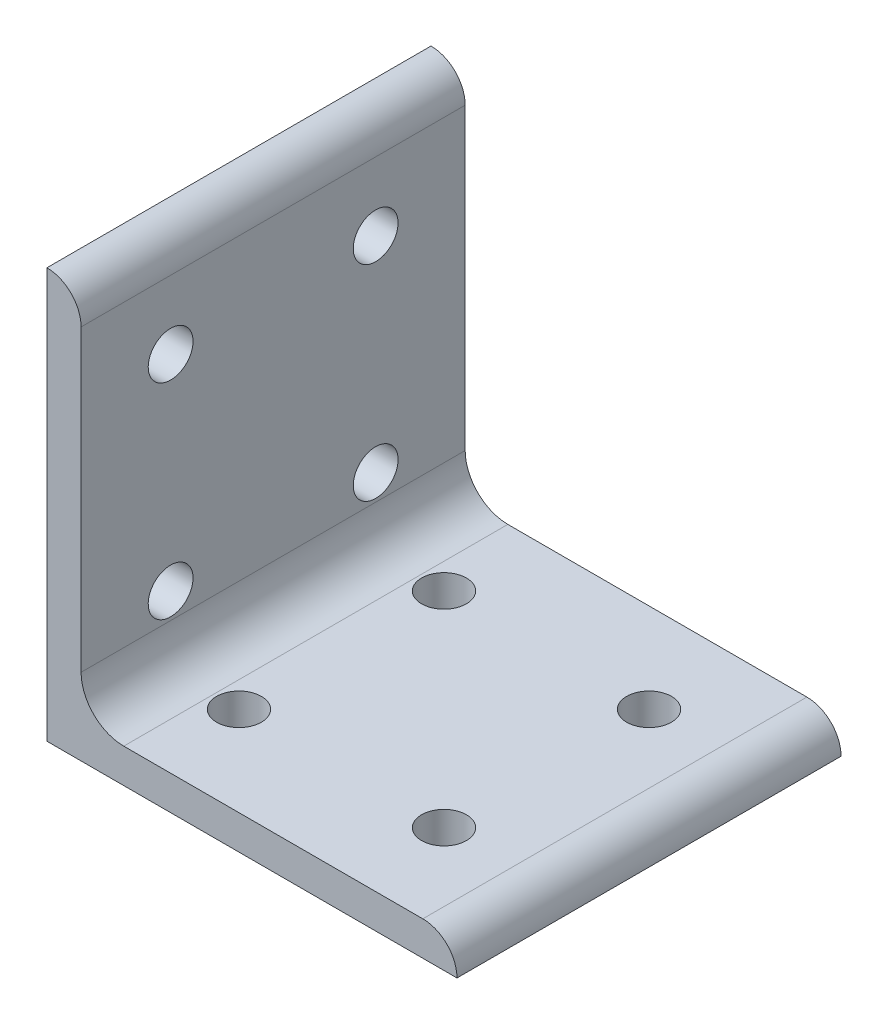
ISO-10303-21;
HEADER;
FILE_DESCRIPTION(('STEP AP214'),'2;1');
FILE_NAME('part.step','',(''),(''),'','','');
FILE_SCHEMA(('AUTOMOTIVE_DESIGN { 1 0 10303 214 1 1 1 1 }'));
ENDSEC;
DATA;
#1=APPLICATION_CONTEXT('core data for automotive mechanical design processes');
#2=APPLICATION_PROTOCOL_DEFINITION('international standard','automotive_design',2000,#1);
#3=PRODUCT_CONTEXT('',#1,'mechanical');
#4=PRODUCT('Part','Part','',(#3));
#5=PRODUCT_RELATED_PRODUCT_CATEGORY('part','',(#4));
#6=PRODUCT_DEFINITION_FORMATION('','',#4);
#7=PRODUCT_DEFINITION_CONTEXT('part definition',#1,'design');
#8=PRODUCT_DEFINITION('design','',#6,#7);
#9=PRODUCT_DEFINITION_SHAPE('','',#8);
#10=(LENGTH_UNIT() NAMED_UNIT(*) SI_UNIT(.MILLI.,.METRE.));
#11=(NAMED_UNIT(*) PLANE_ANGLE_UNIT() SI_UNIT($,.RADIAN.));
#12=(NAMED_UNIT(*) SI_UNIT($,.STERADIAN.) SOLID_ANGLE_UNIT());
#13=UNCERTAINTY_MEASURE_WITH_UNIT(LENGTH_MEASURE(1.E-05),#10,'distance_accuracy_value','');
#14=(GEOMETRIC_REPRESENTATION_CONTEXT(3) GLOBAL_UNCERTAINTY_ASSIGNED_CONTEXT((#13)) GLOBAL_UNIT_ASSIGNED_CONTEXT((#10,
#11,#12)) REPRESENTATION_CONTEXT('',''));
#15=CARTESIAN_POINT('',(0.,0.,0.));
#16=DIRECTION('',(0.,0.,1.));
#17=DIRECTION('',(1.,0.,0.));
#18=AXIS2_PLACEMENT_3D('',#15,#16,#17);
#19=CARTESIAN_POINT('',(6.35,69.85,35.687));
#20=DIRECTION('',(-1.,0.,0.));
#21=DIRECTION('',(0.,-1.,0.));
#22=AXIS2_PLACEMENT_3D('',#19,#20,#21);
#23=PLANE('',#22);
#24=DIRECTION('',(0.,1.,0.));
#25=VECTOR('',#24,1.);
#26=CARTESIAN_POINT('',(6.35,69.85,-35.687));
#27=LINE('',#26,#25);
#28=CARTESIAN_POINT('',(6.35,14.2748,-35.687));
#29=VERTEX_POINT('',#28);
#30=CARTESIAN_POINT('',(6.35,69.85,-35.687));
#31=VERTEX_POINT('',#30);
#32=EDGE_CURVE('E117',#29,#31,#27,.T.);
#33=ORIENTED_EDGE('',*,*,#32,.T.);
#34=DIRECTION('',(0.,0.,-1.));
#35=VECTOR('',#34,1.);
#36=CARTESIAN_POINT('',(6.35,69.85,35.687));
#37=LINE('',#36,#35);
#38=CARTESIAN_POINT('',(6.35,69.85,35.687));
#39=VERTEX_POINT('',#38);
#40=EDGE_CURVE('E114',#39,#31,#37,.T.);
#41=ORIENTED_EDGE('',*,*,#40,.F.);
#42=DIRECTION('',(0.,1.,0.));
#43=VECTOR('',#42,1.);
#44=CARTESIAN_POINT('',(6.35,69.85,35.687));
#45=LINE('',#44,#43);
#46=CARTESIAN_POINT('',(6.35,14.2748,35.687));
#47=VERTEX_POINT('',#46);
#48=EDGE_CURVE('E103',#47,#39,#45,.T.);
#49=ORIENTED_EDGE('',*,*,#48,.F.);
#50=DIRECTION('',(0.,0.,-1.));
#51=VECTOR('',#50,1.);
#52=CARTESIAN_POINT('',(6.35,14.2748,35.687));
#53=LINE('',#52,#51);
#54=EDGE_CURVE('E118',#47,#29,#53,.T.);
#55=ORIENTED_EDGE('',*,*,#54,.T.);
#56=EDGE_LOOP('',(#33,#41,#49,#55));
#57=FACE_BOUND('',#56,.T.);
#58=CARTESIAN_POINT('',(6.34999999999999,19.05,19.05));
#59=DIRECTION('',(-1.,0.,0.));
#60=DIRECTION('',(0.,-1.,0.));
#61=AXIS2_PLACEMENT_3D('',#58,#59,#60);
#62=CIRCLE('',#61,4.1656);
#63=CARTESIAN_POINT('',(6.35,14.8844,19.05));
#64=VERTEX_POINT('',#63);
#65=EDGE_CURVE('E225',#64,#64,#62,.F.);
#66=ORIENTED_EDGE('',*,*,#65,.F.);
#67=EDGE_LOOP('',(#66));
#68=FACE_BOUND('',#67,.T.);
#69=CARTESIAN_POINT('',(6.34999999999999,57.15,19.05));
#70=DIRECTION('',(-1.,0.,0.));
#71=DIRECTION('',(0.,-1.,0.));
#72=AXIS2_PLACEMENT_3D('',#69,#70,#71);
#73=CIRCLE('',#72,4.1656);
#74=CARTESIAN_POINT('',(6.35,52.9844,19.05));
#75=VERTEX_POINT('',#74);
#76=EDGE_CURVE('E222',#75,#75,#73,.F.);
#77=ORIENTED_EDGE('',*,*,#76,.F.);
#78=EDGE_LOOP('',(#77));
#79=FACE_BOUND('',#78,.T.);
#80=CARTESIAN_POINT('',(6.34999999999999,19.05,-19.05));
#81=DIRECTION('',(-1.,0.,0.));
#82=DIRECTION('',(0.,-1.,0.));
#83=AXIS2_PLACEMENT_3D('',#80,#81,#82);
#84=CIRCLE('',#83,4.1656);
#85=CARTESIAN_POINT('',(6.35,14.8844,-19.05));
#86=VERTEX_POINT('',#85);
#87=EDGE_CURVE('E218',#86,#86,#84,.F.);
#88=ORIENTED_EDGE('',*,*,#87,.F.);
#89=EDGE_LOOP('',(#88));
#90=FACE_BOUND('',#89,.T.);
#91=CARTESIAN_POINT('',(6.34999999999999,57.15,-19.05));
#92=DIRECTION('',(-1.,0.,0.));
#93=DIRECTION('',(0.,-1.,0.));
#94=AXIS2_PLACEMENT_3D('',#91,#92,#93);
#95=CIRCLE('',#94,4.1656);
#96=CARTESIAN_POINT('',(6.35,52.9844,-19.05));
#97=VERTEX_POINT('',#96);
#98=EDGE_CURVE('E212',#97,#97,#95,.F.);
#99=ORIENTED_EDGE('',*,*,#98,.F.);
#100=EDGE_LOOP('',(#99));
#101=FACE_BOUND('',#100,.T.);
#102=ADVANCED_FACE('F34',(#57,#68,#79,#90,#101),#23,.F.);
#103=CARTESIAN_POINT('',(0.,0.,35.687));
#104=DIRECTION('',(1.,0.,0.));
#105=DIRECTION('',(0.,0.,-1.));
#106=AXIS2_PLACEMENT_3D('',#103,#104,#105);
#107=PLANE('',#106);
#108=DIRECTION('',(0.,-1.,0.));
#109=VECTOR('',#108,1.);
#110=CARTESIAN_POINT('',(0.,0.,-35.687));
#111=LINE('',#110,#109);
#112=CARTESIAN_POINT('',(0.,76.2,-35.687));
#113=VERTEX_POINT('',#112);
#114=CARTESIAN_POINT('',(0.,0.,-35.687));
#115=VERTEX_POINT('',#114);
#116=EDGE_CURVE('E85',#113,#115,#111,.T.);
#117=ORIENTED_EDGE('',*,*,#116,.T.);
#118=DIRECTION('',(0.,0.,-1.));
#119=VECTOR('',#118,1.);
#120=CARTESIAN_POINT('',(0.,0.,35.687));
#121=LINE('',#120,#119);
#122=CARTESIAN_POINT('',(0.,0.,35.687));
#123=VERTEX_POINT('',#122);
#124=EDGE_CURVE('E123',#123,#115,#121,.T.);
#125=ORIENTED_EDGE('',*,*,#124,.F.);
#126=DIRECTION('',(0.,-1.,0.));
#127=VECTOR('',#126,1.);
#128=CARTESIAN_POINT('',(0.,0.,35.687));
#129=LINE('',#128,#127);
#130=CARTESIAN_POINT('',(0.,76.2,35.687));
#131=VERTEX_POINT('',#130);
#132=EDGE_CURVE('E53',#131,#123,#129,.T.);
#133=ORIENTED_EDGE('',*,*,#132,.F.);
#134=DIRECTION('',(0.,0.,-1.));
#135=VECTOR('',#134,1.);
#136=CARTESIAN_POINT('',(0.,76.2,35.687));
#137=LINE('',#136,#135);
#138=EDGE_CURVE('E119',#131,#113,#137,.T.);
#139=ORIENTED_EDGE('',*,*,#138,.T.);
#140=EDGE_LOOP('',(#117,#125,#133,#139));
#141=FACE_BOUND('',#140,.T.);
#142=CARTESIAN_POINT('',(0.,19.05,19.05));
#143=DIRECTION('',(1.,0.,0.));
#144=DIRECTION('',(0.,0.,-1.));
#145=AXIS2_PLACEMENT_3D('',#142,#143,#144);
#146=CIRCLE('',#145,4.1656);
#147=CARTESIAN_POINT('',(0.,19.05,14.8844));
#148=VERTEX_POINT('',#147);
#149=EDGE_CURVE('E199',#148,#148,#146,.T.);
#150=ORIENTED_EDGE('',*,*,#149,.T.);
#151=EDGE_LOOP('',(#150));
#152=FACE_BOUND('',#151,.T.);
#153=CARTESIAN_POINT('',(0.,57.15,19.05));
#154=DIRECTION('',(1.,0.,0.));
#155=DIRECTION('',(0.,0.,-1.));
#156=AXIS2_PLACEMENT_3D('',#153,#154,#155);
#157=CIRCLE('',#156,4.1656);
#158=CARTESIAN_POINT('',(0.,57.15,14.8844));
#159=VERTEX_POINT('',#158);
#160=EDGE_CURVE('E203',#159,#159,#157,.T.);
#161=ORIENTED_EDGE('',*,*,#160,.T.);
#162=EDGE_LOOP('',(#161));
#163=FACE_BOUND('',#162,.T.);
#164=CARTESIAN_POINT('',(0.,19.05,-19.05));
#165=DIRECTION('',(1.,0.,0.));
#166=DIRECTION('',(0.,0.,-1.));
#167=AXIS2_PLACEMENT_3D('',#164,#165,#166);
#168=CIRCLE('',#167,4.1656);
#169=CARTESIAN_POINT('',(0.,19.05,-23.2156));
#170=VERTEX_POINT('',#169);
#171=EDGE_CURVE('E207',#170,#170,#168,.T.);
#172=ORIENTED_EDGE('',*,*,#171,.T.);
#173=EDGE_LOOP('',(#172));
#174=FACE_BOUND('',#173,.T.);
#175=CARTESIAN_POINT('',(0.,57.15,-19.05));
#176=DIRECTION('',(1.,0.,0.));
#177=DIRECTION('',(0.,0.,-1.));
#178=AXIS2_PLACEMENT_3D('',#175,#176,#177);
#179=CIRCLE('',#178,4.1656);
#180=CARTESIAN_POINT('',(0.,57.15,-23.2156));
#181=VERTEX_POINT('',#180);
#182=EDGE_CURVE('E210',#181,#181,#179,.T.);
#183=ORIENTED_EDGE('',*,*,#182,.T.);
#184=EDGE_LOOP('',(#183));
#185=FACE_BOUND('',#184,.T.);
#186=ADVANCED_FACE('F192',(#141,#152,#163,#174,#185),#107,.F.);
#187=CARTESIAN_POINT('',(76.2,0.,35.687));
#188=DIRECTION('',(0.,1.,0.));
#189=DIRECTION('',(-1.,0.,0.));
#190=AXIS2_PLACEMENT_3D('',#187,#188,#189);
#191=PLANE('',#190);
#192=DIRECTION('',(1.,0.,0.));
#193=VECTOR('',#192,1.);
#194=CARTESIAN_POINT('',(76.2,0.,-35.687));
#195=LINE('',#194,#193);
#196=CARTESIAN_POINT('',(76.2,0.,-35.687));
#197=VERTEX_POINT('',#196);
#198=EDGE_CURVE('E127',#115,#197,#195,.T.);
#199=ORIENTED_EDGE('',*,*,#198,.T.);
#200=DIRECTION('',(0.,0.,-1.));
#201=VECTOR('',#200,1.);
#202=CARTESIAN_POINT('',(76.2,0.,35.687));
#203=LINE('',#202,#201);
#204=CARTESIAN_POINT('',(76.2,0.,35.687));
#205=VERTEX_POINT('',#204);
#206=EDGE_CURVE('E11',#205,#197,#203,.T.);
#207=ORIENTED_EDGE('',*,*,#206,.F.);
#208=DIRECTION('',(1.,0.,0.));
#209=VECTOR('',#208,1.);
#210=CARTESIAN_POINT('',(76.2,0.,35.687));
#211=LINE('',#210,#209);
#212=EDGE_CURVE('E140',#123,#205,#211,.T.);
#213=ORIENTED_EDGE('',*,*,#212,.F.);
#214=ORIENTED_EDGE('',*,*,#124,.T.);
#215=EDGE_LOOP('',(#199,#207,#213,#214));
#216=FACE_BOUND('',#215,.T.);
#217=CARTESIAN_POINT('',(19.05,0.,19.05));
#218=DIRECTION('',(0.,1.,0.));
#219=DIRECTION('',(0.,0.,1.));
#220=AXIS2_PLACEMENT_3D('',#217,#218,#219);
#221=CIRCLE('',#220,4.1656);
#222=CARTESIAN_POINT('',(19.05,0.,14.8844));
#223=VERTEX_POINT('',#222);
#224=EDGE_CURVE('E151',#223,#223,#221,.T.);
#225=ORIENTED_EDGE('',*,*,#224,.T.);
#226=EDGE_LOOP('',(#225));
#227=FACE_BOUND('',#226,.T.);
#228=CARTESIAN_POINT('',(57.15,0.,19.05));
#229=DIRECTION('',(0.,1.,0.));
#230=DIRECTION('',(0.,0.,1.));
#231=AXIS2_PLACEMENT_3D('',#228,#229,#230);
#232=CIRCLE('',#231,4.1656);
#233=CARTESIAN_POINT('',(57.15,0.,14.8844));
#234=VERTEX_POINT('',#233);
#235=EDGE_CURVE('E154',#234,#234,#232,.T.);
#236=ORIENTED_EDGE('',*,*,#235,.T.);
#237=EDGE_LOOP('',(#236));
#238=FACE_BOUND('',#237,.T.);
#239=CARTESIAN_POINT('',(19.05,0.,-19.05));
#240=DIRECTION('',(0.,1.,0.));
#241=DIRECTION('',(0.,0.,1.));
#242=AXIS2_PLACEMENT_3D('',#239,#240,#241);
#243=CIRCLE('',#242,4.1656);
#244=CARTESIAN_POINT('',(19.05,0.,-23.2156));
#245=VERTEX_POINT('',#244);
#246=EDGE_CURVE('E157',#245,#245,#243,.T.);
#247=ORIENTED_EDGE('',*,*,#246,.T.);
#248=EDGE_LOOP('',(#247));
#249=FACE_BOUND('',#248,.T.);
#250=CARTESIAN_POINT('',(57.15,0.,-19.05));
#251=DIRECTION('',(0.,1.,0.));
#252=DIRECTION('',(0.,0.,1.));
#253=AXIS2_PLACEMENT_3D('',#250,#251,#252);
#254=CIRCLE('',#253,4.1656);
#255=CARTESIAN_POINT('',(57.15,0.,-23.2156));
#256=VERTEX_POINT('',#255);
#257=EDGE_CURVE('E167',#256,#256,#254,.T.);
#258=ORIENTED_EDGE('',*,*,#257,.T.);
#259=EDGE_LOOP('',(#258));
#260=FACE_BOUND('',#259,.T.);
#261=ADVANCED_FACE('F36',(#216,#227,#238,#249,#260),#191,.F.);
#262=CARTESIAN_POINT('',(14.2748,6.35,35.687));
#263=DIRECTION('',(0.,-1.,0.));
#264=DIRECTION('',(1.,0.,0.));
#265=AXIS2_PLACEMENT_3D('',#262,#263,#264);
#266=PLANE('',#265);
#267=DIRECTION('',(-1.,0.,0.));
#268=VECTOR('',#267,1.);
#269=CARTESIAN_POINT('',(14.2748,6.35,-35.687));
#270=LINE('',#269,#268);
#271=CARTESIAN_POINT('',(69.85,6.35,-35.687));
#272=VERTEX_POINT('',#271);
#273=CARTESIAN_POINT('',(14.2748,6.35,-35.687));
#274=VERTEX_POINT('',#273);
#275=EDGE_CURVE('E133',#272,#274,#270,.T.);
#276=ORIENTED_EDGE('',*,*,#275,.T.);
#277=DIRECTION('',(0.,0.,-1.));
#278=VECTOR('',#277,1.);
#279=CARTESIAN_POINT('',(14.2748,6.35,35.687));
#280=LINE('',#279,#278);
#281=CARTESIAN_POINT('',(14.2748,6.35,35.687));
#282=VERTEX_POINT('',#281);
#283=EDGE_CURVE('E144',#282,#274,#280,.T.);
#284=ORIENTED_EDGE('',*,*,#283,.F.);
#285=DIRECTION('',(-1.,0.,0.));
#286=VECTOR('',#285,1.);
#287=CARTESIAN_POINT('',(14.2748,6.35,35.687));
#288=LINE('',#287,#286);
#289=CARTESIAN_POINT('',(69.85,6.35,35.687));
#290=VERTEX_POINT('',#289);
#291=EDGE_CURVE('E175',#290,#282,#288,.T.);
#292=ORIENTED_EDGE('',*,*,#291,.F.);
#293=DIRECTION('',(0.,0.,-1.));
#294=VECTOR('',#293,1.);
#295=CARTESIAN_POINT('',(69.85,6.35,35.687));
#296=LINE('',#295,#294);
#297=EDGE_CURVE('E44',#290,#272,#296,.T.);
#298=ORIENTED_EDGE('',*,*,#297,.T.);
#299=EDGE_LOOP('',(#276,#284,#292,#298));
#300=FACE_BOUND('',#299,.T.);
#301=CARTESIAN_POINT('',(19.05,6.35000000000001,19.05));
#302=DIRECTION('',(0.,-1.,0.));
#303=DIRECTION('',(1.,0.,0.));
#304=AXIS2_PLACEMENT_3D('',#301,#302,#303);
#305=CIRCLE('',#304,4.1656);
#306=CARTESIAN_POINT('',(19.05,6.35000000000002,14.8844));
#307=VERTEX_POINT('',#306);
#308=EDGE_CURVE('E131',#307,#307,#305,.F.);
#309=ORIENTED_EDGE('',*,*,#308,.F.);
#310=EDGE_LOOP('',(#309));
#311=FACE_BOUND('',#310,.T.);
#312=CARTESIAN_POINT('',(57.15,6.35000000000001,19.05));
#313=DIRECTION('',(0.,-1.,0.));
#314=DIRECTION('',(1.,0.,0.));
#315=AXIS2_PLACEMENT_3D('',#312,#313,#314);
#316=CIRCLE('',#315,4.1656);
#317=CARTESIAN_POINT('',(57.15,6.35000000000002,14.8844));
#318=VERTEX_POINT('',#317);
#319=EDGE_CURVE('E152',#318,#318,#316,.F.);
#320=ORIENTED_EDGE('',*,*,#319,.F.);
#321=EDGE_LOOP('',(#320));
#322=FACE_BOUND('',#321,.T.);
#323=CARTESIAN_POINT('',(19.05,6.35000000000001,-19.05));
#324=DIRECTION('',(0.,-1.,0.));
#325=DIRECTION('',(1.,0.,0.));
#326=AXIS2_PLACEMENT_3D('',#323,#324,#325);
#327=CIRCLE('',#326,4.1656);
#328=CARTESIAN_POINT('',(19.05,6.35000000000002,-23.2156));
#329=VERTEX_POINT('',#328);
#330=EDGE_CURVE('E155',#329,#329,#327,.F.);
#331=ORIENTED_EDGE('',*,*,#330,.F.);
#332=EDGE_LOOP('',(#331));
#333=FACE_BOUND('',#332,.T.);
#334=CARTESIAN_POINT('',(57.15,6.35000000000001,-19.05));
#335=DIRECTION('',(0.,-1.,0.));
#336=DIRECTION('',(1.,0.,0.));
#337=AXIS2_PLACEMENT_3D('',#334,#335,#336);
#338=CIRCLE('',#337,4.1656);
#339=CARTESIAN_POINT('',(57.15,6.35000000000002,-23.2156));
#340=VERTEX_POINT('',#339);
#341=EDGE_CURVE('E38',#340,#340,#338,.F.);
#342=ORIENTED_EDGE('',*,*,#341,.F.);
#343=EDGE_LOOP('',(#342));
#344=FACE_BOUND('',#343,.T.);
#345=ADVANCED_FACE('F179',(#300,#311,#322,#333,#344),#266,.F.);
#346=CARTESIAN_POINT('',(69.85,0.,35.687));
#347=DIRECTION('',(0.,0.,-1.));
#348=DIRECTION('',(-1.,0.,0.));
#349=AXIS2_PLACEMENT_3D('',#346,#347,#348);
#350=CYLINDRICAL_SURFACE('',#349,6.35000000000001);
#351=CARTESIAN_POINT('',(69.85,0.,-35.687));
#352=DIRECTION('',(0.,0.,1.));
#353=DIRECTION('',(1.,0.,0.));
#354=AXIS2_PLACEMENT_3D('',#351,#352,#353);
#355=CIRCLE('',#354,6.35000000000001);
#356=EDGE_CURVE('E130',#197,#272,#355,.T.);
#357=ORIENTED_EDGE('',*,*,#356,.T.);
#358=ORIENTED_EDGE('',*,*,#297,.F.);
#359=CARTESIAN_POINT('',(69.85,0.,35.687));
#360=DIRECTION('',(0.,0.,1.));
#361=DIRECTION('',(1.,0.,0.));
#362=AXIS2_PLACEMENT_3D('',#359,#360,#361);
#363=CIRCLE('',#362,6.35000000000001);
#364=EDGE_CURVE('E93',#205,#290,#363,.T.);
#365=ORIENTED_EDGE('',*,*,#364,.F.);
#366=ORIENTED_EDGE('',*,*,#206,.T.);
#367=EDGE_LOOP('',(#357,#358,#365,#366));
#368=FACE_BOUND('',#367,.T.);
#369=ADVANCED_FACE('F242',(#368),#350,.T.);
#370=CARTESIAN_POINT('',(14.2748,14.2748,35.687));
#371=DIRECTION('',(0.,0.,-1.));
#372=DIRECTION('',(-1.,0.,0.));
#373=AXIS2_PLACEMENT_3D('',#370,#371,#372);
#374=CYLINDRICAL_SURFACE('',#373,7.9248);
#375=CARTESIAN_POINT('',(14.2748,14.2748,-35.687));
#376=DIRECTION('',(0.,0.,-1.));
#377=DIRECTION('',(1.,0.,0.));
#378=AXIS2_PLACEMENT_3D('',#375,#376,#377);
#379=CIRCLE('',#378,7.9248);
#380=EDGE_CURVE('E135',#274,#29,#379,.T.);
#381=ORIENTED_EDGE('',*,*,#380,.T.);
#382=ORIENTED_EDGE('',*,*,#54,.F.);
#383=CARTESIAN_POINT('',(14.2748,14.2748,35.687));
#384=DIRECTION('',(0.,0.,-1.));
#385=DIRECTION('',(1.,0.,0.));
#386=AXIS2_PLACEMENT_3D('',#383,#384,#385);
#387=CIRCLE('',#386,7.9248);
#388=EDGE_CURVE('E109',#282,#47,#387,.T.);
#389=ORIENTED_EDGE('',*,*,#388,.F.);
#390=ORIENTED_EDGE('',*,*,#283,.T.);
#391=EDGE_LOOP('',(#381,#382,#389,#390));
#392=FACE_BOUND('',#391,.T.);
#393=ADVANCED_FACE('F184',(#392),#374,.F.);
#394=CARTESIAN_POINT('',(0.,69.85,35.687));
#395=DIRECTION('',(0.,0.,-1.));
#396=DIRECTION('',(-1.,0.,0.));
#397=AXIS2_PLACEMENT_3D('',#394,#395,#396);
#398=CYLINDRICAL_SURFACE('',#397,6.35000000000001);
#399=CARTESIAN_POINT('',(0.,69.85,-35.687));
#400=DIRECTION('',(0.,0.,1.));
#401=DIRECTION('',(1.,0.,0.));
#402=AXIS2_PLACEMENT_3D('',#399,#400,#401);
#403=CIRCLE('',#402,6.35000000000001);
#404=EDGE_CURVE('E79',#31,#113,#403,.T.);
#405=ORIENTED_EDGE('',*,*,#404,.T.);
#406=ORIENTED_EDGE('',*,*,#138,.F.);
#407=CARTESIAN_POINT('',(0.,69.85,35.687));
#408=DIRECTION('',(0.,0.,1.));
#409=DIRECTION('',(1.,0.,0.));
#410=AXIS2_PLACEMENT_3D('',#407,#408,#409);
#411=CIRCLE('',#410,6.35000000000001);
#412=EDGE_CURVE('E107',#39,#131,#411,.T.);
#413=ORIENTED_EDGE('',*,*,#412,.F.);
#414=ORIENTED_EDGE('',*,*,#40,.T.);
#415=EDGE_LOOP('',(#405,#406,#413,#414));
#416=FACE_BOUND('',#415,.T.);
#417=ADVANCED_FACE('F121',(#416),#398,.T.);
#418=CARTESIAN_POINT('',(0.,69.85,35.687));
#419=DIRECTION('',(0.,0.,1.));
#420=DIRECTION('',(1.,0.,0.));
#421=AXIS2_PLACEMENT_3D('',#418,#419,#420);
#422=PLANE('',#421);
#423=ORIENTED_EDGE('',*,*,#212,.T.);
#424=ORIENTED_EDGE('',*,*,#364,.T.);
#425=ORIENTED_EDGE('',*,*,#291,.T.);
#426=ORIENTED_EDGE('',*,*,#388,.T.);
#427=ORIENTED_EDGE('',*,*,#48,.T.);
#428=ORIENTED_EDGE('',*,*,#412,.T.);
#429=ORIENTED_EDGE('',*,*,#132,.T.);
#430=EDGE_LOOP('',(#423,#424,#425,#426,#427,#428,#429));
#431=FACE_BOUND('',#430,.T.);
#432=ADVANCED_FACE('F105',(#431),#422,.T.);
#433=CARTESIAN_POINT('',(0.,69.85,-35.687));
#434=DIRECTION('',(0.,0.,1.));
#435=DIRECTION('',(1.,0.,0.));
#436=AXIS2_PLACEMENT_3D('',#433,#434,#435);
#437=PLANE('',#436);
#438=ORIENTED_EDGE('',*,*,#198,.F.);
#439=ORIENTED_EDGE('',*,*,#116,.F.);
#440=ORIENTED_EDGE('',*,*,#404,.F.);
#441=ORIENTED_EDGE('',*,*,#32,.F.);
#442=ORIENTED_EDGE('',*,*,#380,.F.);
#443=ORIENTED_EDGE('',*,*,#275,.F.);
#444=ORIENTED_EDGE('',*,*,#356,.F.);
#445=EDGE_LOOP('',(#438,#439,#440,#441,#442,#443,#444));
#446=FACE_BOUND('',#445,.T.);
#447=ADVANCED_FACE('F187',(#446),#437,.F.);
#448=CARTESIAN_POINT('',(19.05,76.2,19.05));
#449=DIRECTION('',(0.,-1.,0.));
#450=DIRECTION('',(0.,0.,-1.));
#451=AXIS2_PLACEMENT_3D('',#448,#449,#450);
#452=CYLINDRICAL_SURFACE('',#451,4.1656);
#453=CARTESIAN_POINT('',(19.05,0.,14.8844));
#454=CARTESIAN_POINT('',(19.05,0.0661458333333318,14.8844));
#455=CARTESIAN_POINT('',(19.05,0.132291666666664,14.8844));
#456=CARTESIAN_POINT('',(19.05,0.264583333333332,14.8844));
#457=CARTESIAN_POINT('',(19.05,0.330729166666668,14.8844));
#458=CARTESIAN_POINT('',(19.05,0.463020833333337,14.8844));
#459=CARTESIAN_POINT('',(19.05,0.529166666666669,14.8844));
#460=CARTESIAN_POINT('',(19.05,0.661458333333337,14.8844));
#461=CARTESIAN_POINT('',(19.05,0.727604166666673,14.8844));
#462=CARTESIAN_POINT('',(19.05,0.859895833333342,14.8844));
#463=CARTESIAN_POINT('',(19.05,0.926041666666673,14.8844));
#464=CARTESIAN_POINT('',(19.05,1.05833333333334,14.8844));
#465=CARTESIAN_POINT('',(19.05,1.12447916666667,14.8844));
#466=CARTESIAN_POINT('',(19.05,1.25677083333334,14.8844));
#467=CARTESIAN_POINT('',(19.05,1.32291666666667,14.8844));
#468=CARTESIAN_POINT('',(19.05,1.45520833333334,14.8844));
#469=CARTESIAN_POINT('',(19.05,1.52135416666667,14.8844));
#470=CARTESIAN_POINT('',(19.05,1.65364583333334,14.8844));
#471=CARTESIAN_POINT('',(19.05,1.71979166666667,14.8844));
#472=CARTESIAN_POINT('',(19.05,1.85208333333334,14.8844));
#473=CARTESIAN_POINT('',(19.05,1.91822916666667,14.8844));
#474=CARTESIAN_POINT('',(19.05,2.05052083333334,14.8844));
#475=CARTESIAN_POINT('',(19.05,2.11666666666667,14.8844));
#476=CARTESIAN_POINT('',(19.05,2.24895833333334,14.8844));
#477=CARTESIAN_POINT('',(19.05,2.31510416666667,14.8844));
#478=CARTESIAN_POINT('',(19.05,2.44739583333334,14.8844));
#479=CARTESIAN_POINT('',(19.05,2.51354166666667,14.8844));
#480=CARTESIAN_POINT('',(19.05,2.64583333333334,14.8844));
#481=CARTESIAN_POINT('',(19.05,2.71197916666667,14.8844));
#482=CARTESIAN_POINT('',(19.05,2.84427083333334,14.8844));
#483=CARTESIAN_POINT('',(19.05,2.91041666666668,14.8844));
#484=CARTESIAN_POINT('',(19.05,3.04270833333335,14.8844));
#485=CARTESIAN_POINT('',(19.05,3.10885416666668,14.8844));
#486=CARTESIAN_POINT('',(19.05,3.24114583333334,14.8844));
#487=CARTESIAN_POINT('',(19.05,3.30729166666667,14.8844));
#488=CARTESIAN_POINT('',(19.05,3.43958333333334,14.8844));
#489=CARTESIAN_POINT('',(19.05,3.50572916666668,14.8844));
#490=CARTESIAN_POINT('',(19.05,3.63802083333335,14.8844));
#491=CARTESIAN_POINT('',(19.05,3.70416666666668,14.8844));
#492=CARTESIAN_POINT('',(19.05,3.83645833333335,14.8844));
#493=CARTESIAN_POINT('',(19.05,3.90260416666668,14.8844));
#494=CARTESIAN_POINT('',(19.05,4.03489583333335,14.8844));
#495=CARTESIAN_POINT('',(19.05,4.10104166666668,14.8844));
#496=CARTESIAN_POINT('',(19.05,4.23333333333335,14.8844));
#497=CARTESIAN_POINT('',(19.05,4.29947916666668,14.8844));
#498=CARTESIAN_POINT('',(19.05,4.43177083333335,14.8844));
#499=CARTESIAN_POINT('',(19.05,4.49791666666668,14.8844));
#500=CARTESIAN_POINT('',(19.05,4.63020833333335,14.8844));
#501=CARTESIAN_POINT('',(19.05,4.69635416666668,14.8844));
#502=CARTESIAN_POINT('',(19.05,4.82864583333335,14.8844));
#503=CARTESIAN_POINT('',(19.05,4.89479166666668,14.8844));
#504=CARTESIAN_POINT('',(19.05,5.02708333333335,14.8844));
#505=CARTESIAN_POINT('',(19.05,5.09322916666668,14.8844));
#506=CARTESIAN_POINT('',(19.05,5.22552083333335,14.8844));
#507=CARTESIAN_POINT('',(19.05,5.29166666666668,14.8844));
#508=CARTESIAN_POINT('',(19.05,5.42395833333335,14.8844));
#509=CARTESIAN_POINT('',(19.05,5.49010416666668,14.8844));
#510=CARTESIAN_POINT('',(19.05,5.62239583333335,14.8844));
#511=CARTESIAN_POINT('',(19.05,5.68854166666669,14.8844));
#512=CARTESIAN_POINT('',(19.05,5.82083333333335,14.8844));
#513=CARTESIAN_POINT('',(19.05,5.88697916666669,14.8844));
#514=CARTESIAN_POINT('',(19.05,6.01927083333335,14.8844));
#515=CARTESIAN_POINT('',(19.05,6.08541666666669,14.8844));
#516=CARTESIAN_POINT('',(19.05,6.21770833333336,14.8844));
#517=CARTESIAN_POINT('',(19.05,6.28385416666669,14.8844));
#518=CARTESIAN_POINT('',(19.05,6.35000000000002,14.8844));
#519=B_SPLINE_CURVE_WITH_KNOTS('',3,(#453,#454,#455,#456,#457,#458,#459,#460,#461,#462,#463,
#464,#465,#466,#467,#468,#469,#470,#471,#472,#473,#474,#475,#476,#477,#478,#479,#480,#481,#482,
#483,#484,#485,#486,#487,#488,#489,#490,#491,#492,#493,#494,#495,#496,#497,#498,#499,#500,#501,
#502,#503,#504,#505,#506,#507,#508,#509,#510,#511,#512,#513,#514,#515,#516,#517,#518),
.UNSPECIFIED.,.F.,.F.,(4,2,2,2,2,2,2,2,2,2,2,2,2,2,2,2,2,2,2,2,2,2,2,2,2,2,2,2,2,2,2,2,4),(0.,
0.198437499999995,0.396875000000005,0.5953125,0.79375000000001,0.992187500000005,1.190625,
1.38906250000001,1.58750000000001,1.7859375,1.98437500000001,2.18281250000001,2.38125,
2.57968750000001,2.77812500000001,2.97656250000002,3.17500000000001,3.37343750000001,
3.57187500000002,3.77031250000001,3.96875000000002,4.16718750000002,4.36562500000001,
4.56406250000002,4.76250000000002,4.96093750000001,5.15937500000002,5.35781250000002,
5.55625000000001,5.75468750000002,5.95312500000002,6.15156250000003,6.35000000000002),.UNSPECIFIED.);
#520=EDGE_CURVE('BSEAM265',#223,#307,#519,.T.);
#521=ORIENTED_EDGE('',*,*,#224,.F.);
#522=ORIENTED_EDGE('',*,*,#308,.T.);
#523=ORIENTED_EDGE('',*,*,#520,.T.);
#524=ORIENTED_EDGE('',*,*,#520,.F.);
#525=EDGE_LOOP('',(#521,#523,#522,#524));
#526=FACE_BOUND('',#525,.T.);
#527=ADVANCED_FACE('F265',(#526),#452,.F.);
#528=CARTESIAN_POINT('',(57.15,76.2,19.05));
#529=DIRECTION('',(0.,-1.,0.));
#530=DIRECTION('',(0.,0.,-1.));
#531=AXIS2_PLACEMENT_3D('',#528,#529,#530);
#532=CYLINDRICAL_SURFACE('',#531,4.1656);
#533=CARTESIAN_POINT('',(57.15,0.,14.8844));
#534=CARTESIAN_POINT('',(57.15,0.0661458333333318,14.8844));
#535=CARTESIAN_POINT('',(57.15,0.132291666666664,14.8844));
#536=CARTESIAN_POINT('',(57.15,0.264583333333332,14.8844));
#537=CARTESIAN_POINT('',(57.15,0.330729166666668,14.8844));
#538=CARTESIAN_POINT('',(57.15,0.463020833333337,14.8844));
#539=CARTESIAN_POINT('',(57.15,0.529166666666669,14.8844));
#540=CARTESIAN_POINT('',(57.15,0.661458333333337,14.8844));
#541=CARTESIAN_POINT('',(57.15,0.727604166666673,14.8844));
#542=CARTESIAN_POINT('',(57.15,0.859895833333342,14.8844));
#543=CARTESIAN_POINT('',(57.15,0.926041666666673,14.8844));
#544=CARTESIAN_POINT('',(57.15,1.05833333333334,14.8844));
#545=CARTESIAN_POINT('',(57.15,1.12447916666667,14.8844));
#546=CARTESIAN_POINT('',(57.15,1.25677083333334,14.8844));
#547=CARTESIAN_POINT('',(57.15,1.32291666666667,14.8844));
#548=CARTESIAN_POINT('',(57.15,1.45520833333334,14.8844));
#549=CARTESIAN_POINT('',(57.15,1.52135416666667,14.8844));
#550=CARTESIAN_POINT('',(57.15,1.65364583333334,14.8844));
#551=CARTESIAN_POINT('',(57.15,1.71979166666667,14.8844));
#552=CARTESIAN_POINT('',(57.15,1.85208333333334,14.8844));
#553=CARTESIAN_POINT('',(57.15,1.91822916666667,14.8844));
#554=CARTESIAN_POINT('',(57.15,2.05052083333334,14.8844));
#555=CARTESIAN_POINT('',(57.15,2.11666666666667,14.8844));
#556=CARTESIAN_POINT('',(57.15,2.24895833333334,14.8844));
#557=CARTESIAN_POINT('',(57.15,2.31510416666667,14.8844));
#558=CARTESIAN_POINT('',(57.15,2.44739583333334,14.8844));
#559=CARTESIAN_POINT('',(57.15,2.51354166666667,14.8844));
#560=CARTESIAN_POINT('',(57.15,2.64583333333334,14.8844));
#561=CARTESIAN_POINT('',(57.15,2.71197916666667,14.8844));
#562=CARTESIAN_POINT('',(57.15,2.84427083333334,14.8844));
#563=CARTESIAN_POINT('',(57.15,2.91041666666668,14.8844));
#564=CARTESIAN_POINT('',(57.15,3.04270833333335,14.8844));
#565=CARTESIAN_POINT('',(57.15,3.10885416666668,14.8844));
#566=CARTESIAN_POINT('',(57.15,3.24114583333334,14.8844));
#567=CARTESIAN_POINT('',(57.15,3.30729166666667,14.8844));
#568=CARTESIAN_POINT('',(57.15,3.43958333333334,14.8844));
#569=CARTESIAN_POINT('',(57.15,3.50572916666668,14.8844));
#570=CARTESIAN_POINT('',(57.15,3.63802083333335,14.8844));
#571=CARTESIAN_POINT('',(57.15,3.70416666666668,14.8844));
#572=CARTESIAN_POINT('',(57.15,3.83645833333335,14.8844));
#573=CARTESIAN_POINT('',(57.15,3.90260416666668,14.8844));
#574=CARTESIAN_POINT('',(57.15,4.03489583333335,14.8844));
#575=CARTESIAN_POINT('',(57.15,4.10104166666668,14.8844));
#576=CARTESIAN_POINT('',(57.15,4.23333333333335,14.8844));
#577=CARTESIAN_POINT('',(57.15,4.29947916666668,14.8844));
#578=CARTESIAN_POINT('',(57.15,4.43177083333335,14.8844));
#579=CARTESIAN_POINT('',(57.15,4.49791666666668,14.8844));
#580=CARTESIAN_POINT('',(57.15,4.63020833333335,14.8844));
#581=CARTESIAN_POINT('',(57.15,4.69635416666668,14.8844));
#582=CARTESIAN_POINT('',(57.15,4.82864583333335,14.8844));
#583=CARTESIAN_POINT('',(57.15,4.89479166666668,14.8844));
#584=CARTESIAN_POINT('',(57.15,5.02708333333335,14.8844));
#585=CARTESIAN_POINT('',(57.15,5.09322916666668,14.8844));
#586=CARTESIAN_POINT('',(57.15,5.22552083333335,14.8844));
#587=CARTESIAN_POINT('',(57.15,5.29166666666668,14.8844));
#588=CARTESIAN_POINT('',(57.15,5.42395833333335,14.8844));
#589=CARTESIAN_POINT('',(57.15,5.49010416666668,14.8844));
#590=CARTESIAN_POINT('',(57.15,5.62239583333335,14.8844));
#591=CARTESIAN_POINT('',(57.15,5.68854166666669,14.8844));
#592=CARTESIAN_POINT('',(57.15,5.82083333333335,14.8844));
#593=CARTESIAN_POINT('',(57.15,5.88697916666669,14.8844));
#594=CARTESIAN_POINT('',(57.15,6.01927083333335,14.8844));
#595=CARTESIAN_POINT('',(57.15,6.08541666666669,14.8844));
#596=CARTESIAN_POINT('',(57.15,6.21770833333336,14.8844));
#597=CARTESIAN_POINT('',(57.15,6.28385416666669,14.8844));
#598=CARTESIAN_POINT('',(57.15,6.35000000000002,14.8844));
#599=B_SPLINE_CURVE_WITH_KNOTS('',3,(#533,#534,#535,#536,#537,#538,#539,#540,#541,#542,#543,
#544,#545,#546,#547,#548,#549,#550,#551,#552,#553,#554,#555,#556,#557,#558,#559,#560,#561,#562,
#563,#564,#565,#566,#567,#568,#569,#570,#571,#572,#573,#574,#575,#576,#577,#578,#579,#580,#581,
#582,#583,#584,#585,#586,#587,#588,#589,#590,#591,#592,#593,#594,#595,#596,#597,#598),
.UNSPECIFIED.,.F.,.F.,(4,2,2,2,2,2,2,2,2,2,2,2,2,2,2,2,2,2,2,2,2,2,2,2,2,2,2,2,2,2,2,2,4),(0.,
0.198437499999995,0.396875000000005,0.5953125,0.79375000000001,0.992187500000005,1.190625,
1.38906250000001,1.58750000000001,1.7859375,1.98437500000001,2.18281250000001,2.38125,
2.57968750000001,2.77812500000001,2.97656250000002,3.17500000000001,3.37343750000001,
3.57187500000002,3.77031250000001,3.96875000000002,4.16718750000002,4.36562500000001,
4.56406250000002,4.76250000000002,4.96093750000001,5.15937500000002,5.35781250000002,
5.55625000000001,5.75468750000002,5.95312500000002,6.15156250000003,6.35000000000002),.UNSPECIFIED.);
#600=EDGE_CURVE('BSEAM270',#234,#318,#599,.T.);
#601=ORIENTED_EDGE('',*,*,#235,.F.);
#602=ORIENTED_EDGE('',*,*,#319,.T.);
#603=ORIENTED_EDGE('',*,*,#600,.T.);
#604=ORIENTED_EDGE('',*,*,#600,.F.);
#605=EDGE_LOOP('',(#601,#603,#602,#604));
#606=FACE_BOUND('',#605,.T.);
#607=ADVANCED_FACE('F270',(#606),#532,.F.);
#608=CARTESIAN_POINT('',(19.05,76.2,-19.05));
#609=DIRECTION('',(0.,-1.,0.));
#610=DIRECTION('',(0.,0.,-1.));
#611=AXIS2_PLACEMENT_3D('',#608,#609,#610);
#612=CYLINDRICAL_SURFACE('',#611,4.1656);
#613=CARTESIAN_POINT('',(19.05,0.,-23.2156));
#614=CARTESIAN_POINT('',(19.05,0.0661458333333318,-23.2156));
#615=CARTESIAN_POINT('',(19.05,0.132291666666664,-23.2156));
#616=CARTESIAN_POINT('',(19.05,0.264583333333332,-23.2156));
#617=CARTESIAN_POINT('',(19.05,0.330729166666668,-23.2156));
#618=CARTESIAN_POINT('',(19.05,0.463020833333337,-23.2156));
#619=CARTESIAN_POINT('',(19.05,0.529166666666669,-23.2156));
#620=CARTESIAN_POINT('',(19.05,0.661458333333337,-23.2156));
#621=CARTESIAN_POINT('',(19.05,0.727604166666673,-23.2156));
#622=CARTESIAN_POINT('',(19.05,0.859895833333342,-23.2156));
#623=CARTESIAN_POINT('',(19.05,0.926041666666673,-23.2156));
#624=CARTESIAN_POINT('',(19.05,1.05833333333334,-23.2156));
#625=CARTESIAN_POINT('',(19.05,1.12447916666667,-23.2156));
#626=CARTESIAN_POINT('',(19.05,1.25677083333334,-23.2156));
#627=CARTESIAN_POINT('',(19.05,1.32291666666667,-23.2156));
#628=CARTESIAN_POINT('',(19.05,1.45520833333334,-23.2156));
#629=CARTESIAN_POINT('',(19.05,1.52135416666667,-23.2156));
#630=CARTESIAN_POINT('',(19.05,1.65364583333334,-23.2156));
#631=CARTESIAN_POINT('',(19.05,1.71979166666667,-23.2156));
#632=CARTESIAN_POINT('',(19.05,1.85208333333334,-23.2156));
#633=CARTESIAN_POINT('',(19.05,1.91822916666667,-23.2156));
#634=CARTESIAN_POINT('',(19.05,2.05052083333334,-23.2156));
#635=CARTESIAN_POINT('',(19.05,2.11666666666667,-23.2156));
#636=CARTESIAN_POINT('',(19.05,2.24895833333334,-23.2156));
#637=CARTESIAN_POINT('',(19.05,2.31510416666667,-23.2156));
#638=CARTESIAN_POINT('',(19.05,2.44739583333334,-23.2156));
#639=CARTESIAN_POINT('',(19.05,2.51354166666667,-23.2156));
#640=CARTESIAN_POINT('',(19.05,2.64583333333334,-23.2156));
#641=CARTESIAN_POINT('',(19.05,2.71197916666667,-23.2156));
#642=CARTESIAN_POINT('',(19.05,2.84427083333334,-23.2156));
#643=CARTESIAN_POINT('',(19.05,2.91041666666668,-23.2156));
#644=CARTESIAN_POINT('',(19.05,3.04270833333335,-23.2156));
#645=CARTESIAN_POINT('',(19.05,3.10885416666668,-23.2156));
#646=CARTESIAN_POINT('',(19.05,3.24114583333334,-23.2156));
#647=CARTESIAN_POINT('',(19.05,3.30729166666667,-23.2156));
#648=CARTESIAN_POINT('',(19.05,3.43958333333334,-23.2156));
#649=CARTESIAN_POINT('',(19.05,3.50572916666668,-23.2156));
#650=CARTESIAN_POINT('',(19.05,3.63802083333335,-23.2156));
#651=CARTESIAN_POINT('',(19.05,3.70416666666668,-23.2156));
#652=CARTESIAN_POINT('',(19.05,3.83645833333335,-23.2156));
#653=CARTESIAN_POINT('',(19.05,3.90260416666668,-23.2156));
#654=CARTESIAN_POINT('',(19.05,4.03489583333335,-23.2156));
#655=CARTESIAN_POINT('',(19.05,4.10104166666668,-23.2156));
#656=CARTESIAN_POINT('',(19.05,4.23333333333335,-23.2156));
#657=CARTESIAN_POINT('',(19.05,4.29947916666668,-23.2156));
#658=CARTESIAN_POINT('',(19.05,4.43177083333335,-23.2156));
#659=CARTESIAN_POINT('',(19.05,4.49791666666668,-23.2156));
#660=CARTESIAN_POINT('',(19.05,4.63020833333335,-23.2156));
#661=CARTESIAN_POINT('',(19.05,4.69635416666668,-23.2156));
#662=CARTESIAN_POINT('',(19.05,4.82864583333335,-23.2156));
#663=CARTESIAN_POINT('',(19.05,4.89479166666668,-23.2156));
#664=CARTESIAN_POINT('',(19.05,5.02708333333335,-23.2156));
#665=CARTESIAN_POINT('',(19.05,5.09322916666668,-23.2156));
#666=CARTESIAN_POINT('',(19.05,5.22552083333335,-23.2156));
#667=CARTESIAN_POINT('',(19.05,5.29166666666668,-23.2156));
#668=CARTESIAN_POINT('',(19.05,5.42395833333335,-23.2156));
#669=CARTESIAN_POINT('',(19.05,5.49010416666668,-23.2156));
#670=CARTESIAN_POINT('',(19.05,5.62239583333335,-23.2156));
#671=CARTESIAN_POINT('',(19.05,5.68854166666669,-23.2156));
#672=CARTESIAN_POINT('',(19.05,5.82083333333335,-23.2156));
#673=CARTESIAN_POINT('',(19.05,5.88697916666669,-23.2156));
#674=CARTESIAN_POINT('',(19.05,6.01927083333335,-23.2156));
#675=CARTESIAN_POINT('',(19.05,6.08541666666669,-23.2156));
#676=CARTESIAN_POINT('',(19.05,6.21770833333336,-23.2156));
#677=CARTESIAN_POINT('',(19.05,6.28385416666669,-23.2156));
#678=CARTESIAN_POINT('',(19.05,6.35000000000002,-23.2156));
#679=B_SPLINE_CURVE_WITH_KNOTS('',3,(#613,#614,#615,#616,#617,#618,#619,#620,#621,#622,#623,
#624,#625,#626,#627,#628,#629,#630,#631,#632,#633,#634,#635,#636,#637,#638,#639,#640,#641,#642,
#643,#644,#645,#646,#647,#648,#649,#650,#651,#652,#653,#654,#655,#656,#657,#658,#659,#660,#661,
#662,#663,#664,#665,#666,#667,#668,#669,#670,#671,#672,#673,#674,#675,#676,#677,#678),
.UNSPECIFIED.,.F.,.F.,(4,2,2,2,2,2,2,2,2,2,2,2,2,2,2,2,2,2,2,2,2,2,2,2,2,2,2,2,2,2,2,2,4),(0.,
0.198437499999995,0.396875000000005,0.5953125,0.79375000000001,0.992187500000005,1.190625,
1.38906250000001,1.58750000000001,1.7859375,1.98437500000001,2.18281250000001,2.38125,
2.57968750000001,2.77812500000001,2.97656250000002,3.17500000000001,3.37343750000001,
3.57187500000002,3.77031250000001,3.96875000000002,4.16718750000002,4.36562500000001,
4.56406250000002,4.76250000000002,4.96093750000001,5.15937500000002,5.35781250000002,
5.55625000000001,5.75468750000002,5.95312500000002,6.15156250000003,6.35000000000002),.UNSPECIFIED.);
#680=EDGE_CURVE('BSEAM237',#245,#329,#679,.T.);
#681=ORIENTED_EDGE('',*,*,#246,.F.);
#682=ORIENTED_EDGE('',*,*,#330,.T.);
#683=ORIENTED_EDGE('',*,*,#680,.T.);
#684=ORIENTED_EDGE('',*,*,#680,.F.);
#685=EDGE_LOOP('',(#681,#683,#682,#684));
#686=FACE_BOUND('',#685,.T.);
#687=ADVANCED_FACE('F237',(#686),#612,.F.);
#688=CARTESIAN_POINT('',(57.15,76.2,-19.05));
#689=DIRECTION('',(0.,-1.,0.));
#690=DIRECTION('',(0.,0.,-1.));
#691=AXIS2_PLACEMENT_3D('',#688,#689,#690);
#692=CYLINDRICAL_SURFACE('',#691,4.1656);
#693=CARTESIAN_POINT('',(57.15,0.,-23.2156));
#694=CARTESIAN_POINT('',(57.15,0.0661458333333318,-23.2156));
#695=CARTESIAN_POINT('',(57.15,0.132291666666664,-23.2156));
#696=CARTESIAN_POINT('',(57.15,0.264583333333332,-23.2156));
#697=CARTESIAN_POINT('',(57.15,0.330729166666668,-23.2156));
#698=CARTESIAN_POINT('',(57.15,0.463020833333337,-23.2156));
#699=CARTESIAN_POINT('',(57.15,0.529166666666669,-23.2156));
#700=CARTESIAN_POINT('',(57.15,0.661458333333337,-23.2156));
#701=CARTESIAN_POINT('',(57.15,0.727604166666673,-23.2156));
#702=CARTESIAN_POINT('',(57.15,0.859895833333342,-23.2156));
#703=CARTESIAN_POINT('',(57.15,0.926041666666673,-23.2156));
#704=CARTESIAN_POINT('',(57.15,1.05833333333334,-23.2156));
#705=CARTESIAN_POINT('',(57.15,1.12447916666667,-23.2156));
#706=CARTESIAN_POINT('',(57.15,1.25677083333334,-23.2156));
#707=CARTESIAN_POINT('',(57.15,1.32291666666667,-23.2156));
#708=CARTESIAN_POINT('',(57.15,1.45520833333334,-23.2156));
#709=CARTESIAN_POINT('',(57.15,1.52135416666667,-23.2156));
#710=CARTESIAN_POINT('',(57.15,1.65364583333334,-23.2156));
#711=CARTESIAN_POINT('',(57.15,1.71979166666667,-23.2156));
#712=CARTESIAN_POINT('',(57.15,1.85208333333334,-23.2156));
#713=CARTESIAN_POINT('',(57.15,1.91822916666667,-23.2156));
#714=CARTESIAN_POINT('',(57.15,2.05052083333334,-23.2156));
#715=CARTESIAN_POINT('',(57.15,2.11666666666667,-23.2156));
#716=CARTESIAN_POINT('',(57.15,2.24895833333334,-23.2156));
#717=CARTESIAN_POINT('',(57.15,2.31510416666667,-23.2156));
#718=CARTESIAN_POINT('',(57.15,2.44739583333334,-23.2156));
#719=CARTESIAN_POINT('',(57.15,2.51354166666667,-23.2156));
#720=CARTESIAN_POINT('',(57.15,2.64583333333334,-23.2156));
#721=CARTESIAN_POINT('',(57.15,2.71197916666667,-23.2156));
#722=CARTESIAN_POINT('',(57.15,2.84427083333334,-23.2156));
#723=CARTESIAN_POINT('',(57.15,2.91041666666668,-23.2156));
#724=CARTESIAN_POINT('',(57.15,3.04270833333335,-23.2156));
#725=CARTESIAN_POINT('',(57.15,3.10885416666668,-23.2156));
#726=CARTESIAN_POINT('',(57.15,3.24114583333334,-23.2156));
#727=CARTESIAN_POINT('',(57.15,3.30729166666667,-23.2156));
#728=CARTESIAN_POINT('',(57.15,3.43958333333334,-23.2156));
#729=CARTESIAN_POINT('',(57.15,3.50572916666668,-23.2156));
#730=CARTESIAN_POINT('',(57.15,3.63802083333335,-23.2156));
#731=CARTESIAN_POINT('',(57.15,3.70416666666668,-23.2156));
#732=CARTESIAN_POINT('',(57.15,3.83645833333335,-23.2156));
#733=CARTESIAN_POINT('',(57.15,3.90260416666668,-23.2156));
#734=CARTESIAN_POINT('',(57.15,4.03489583333335,-23.2156));
#735=CARTESIAN_POINT('',(57.15,4.10104166666668,-23.2156));
#736=CARTESIAN_POINT('',(57.15,4.23333333333335,-23.2156));
#737=CARTESIAN_POINT('',(57.15,4.29947916666668,-23.2156));
#738=CARTESIAN_POINT('',(57.15,4.43177083333335,-23.2156));
#739=CARTESIAN_POINT('',(57.15,4.49791666666668,-23.2156));
#740=CARTESIAN_POINT('',(57.15,4.63020833333335,-23.2156));
#741=CARTESIAN_POINT('',(57.15,4.69635416666668,-23.2156));
#742=CARTESIAN_POINT('',(57.15,4.82864583333335,-23.2156));
#743=CARTESIAN_POINT('',(57.15,4.89479166666668,-23.2156));
#744=CARTESIAN_POINT('',(57.15,5.02708333333335,-23.2156));
#745=CARTESIAN_POINT('',(57.15,5.09322916666668,-23.2156));
#746=CARTESIAN_POINT('',(57.15,5.22552083333335,-23.2156));
#747=CARTESIAN_POINT('',(57.15,5.29166666666668,-23.2156));
#748=CARTESIAN_POINT('',(57.15,5.42395833333335,-23.2156));
#749=CARTESIAN_POINT('',(57.15,5.49010416666668,-23.2156));
#750=CARTESIAN_POINT('',(57.15,5.62239583333335,-23.2156));
#751=CARTESIAN_POINT('',(57.15,5.68854166666669,-23.2156));
#752=CARTESIAN_POINT('',(57.15,5.82083333333335,-23.2156));
#753=CARTESIAN_POINT('',(57.15,5.88697916666669,-23.2156));
#754=CARTESIAN_POINT('',(57.15,6.01927083333335,-23.2156));
#755=CARTESIAN_POINT('',(57.15,6.08541666666669,-23.2156));
#756=CARTESIAN_POINT('',(57.15,6.21770833333336,-23.2156));
#757=CARTESIAN_POINT('',(57.15,6.28385416666669,-23.2156));
#758=CARTESIAN_POINT('',(57.15,6.35000000000002,-23.2156));
#759=B_SPLINE_CURVE_WITH_KNOTS('',3,(#693,#694,#695,#696,#697,#698,#699,#700,#701,#702,#703,
#704,#705,#706,#707,#708,#709,#710,#711,#712,#713,#714,#715,#716,#717,#718,#719,#720,#721,#722,
#723,#724,#725,#726,#727,#728,#729,#730,#731,#732,#733,#734,#735,#736,#737,#738,#739,#740,#741,
#742,#743,#744,#745,#746,#747,#748,#749,#750,#751,#752,#753,#754,#755,#756,#757,#758),
.UNSPECIFIED.,.F.,.F.,(4,2,2,2,2,2,2,2,2,2,2,2,2,2,2,2,2,2,2,2,2,2,2,2,2,2,2,2,2,2,2,2,4),(0.,
0.198437499999995,0.396875000000005,0.5953125,0.79375000000001,0.992187500000005,1.190625,
1.38906250000001,1.58750000000001,1.7859375,1.98437500000001,2.18281250000001,2.38125,
2.57968750000001,2.77812500000001,2.97656250000002,3.17500000000001,3.37343750000001,
3.57187500000002,3.77031250000001,3.96875000000002,4.16718750000002,4.36562500000001,
4.56406250000002,4.76250000000002,4.96093750000001,5.15937500000002,5.35781250000002,
5.55625000000001,5.75468750000002,5.95312500000002,6.15156250000003,6.35000000000002),.UNSPECIFIED.);
#760=EDGE_CURVE('BSEAM233',#256,#340,#759,.T.);
#761=ORIENTED_EDGE('',*,*,#257,.F.);
#762=ORIENTED_EDGE('',*,*,#341,.T.);
#763=ORIENTED_EDGE('',*,*,#760,.T.);
#764=ORIENTED_EDGE('',*,*,#760,.F.);
#765=EDGE_LOOP('',(#761,#763,#762,#764));
#766=FACE_BOUND('',#765,.T.);
#767=ADVANCED_FACE('F233',(#766),#692,.F.);
#768=CARTESIAN_POINT('',(76.2,19.05,19.05));
#769=DIRECTION('',(-1.,0.,0.));
#770=DIRECTION('',(0.,0.,1.));
#771=AXIS2_PLACEMENT_3D('',#768,#769,#770);
#772=CYLINDRICAL_SURFACE('',#771,4.1656);
#773=ORIENTED_EDGE('',*,*,#149,.F.);
#774=EDGE_LOOP('',(#773));
#775=FACE_BOUND('',#774,.T.);
#776=ORIENTED_EDGE('',*,*,#65,.T.);
#777=EDGE_LOOP('',(#776));
#778=FACE_BOUND('',#777,.T.);
#779=ADVANCED_FACE('F236',(#775,#778),#772,.F.);
#780=CARTESIAN_POINT('',(76.2,57.15,19.05));
#781=DIRECTION('',(-1.,0.,0.));
#782=DIRECTION('',(0.,0.,1.));
#783=AXIS2_PLACEMENT_3D('',#780,#781,#782);
#784=CYLINDRICAL_SURFACE('',#783,4.1656);
#785=ORIENTED_EDGE('',*,*,#160,.F.);
#786=EDGE_LOOP('',(#785));
#787=FACE_BOUND('',#786,.T.);
#788=ORIENTED_EDGE('',*,*,#76,.T.);
#789=EDGE_LOOP('',(#788));
#790=FACE_BOUND('',#789,.T.);
#791=ADVANCED_FACE('F280',(#787,#790),#784,.F.);
#792=CARTESIAN_POINT('',(76.2,19.05,-19.05));
#793=DIRECTION('',(-1.,0.,0.));
#794=DIRECTION('',(0.,0.,1.));
#795=AXIS2_PLACEMENT_3D('',#792,#793,#794);
#796=CYLINDRICAL_SURFACE('',#795,4.1656);
#797=ORIENTED_EDGE('',*,*,#171,.F.);
#798=EDGE_LOOP('',(#797));
#799=FACE_BOUND('',#798,.T.);
#800=ORIENTED_EDGE('',*,*,#87,.T.);
#801=EDGE_LOOP('',(#800));
#802=FACE_BOUND('',#801,.T.);
#803=ADVANCED_FACE('F284',(#799,#802),#796,.F.);
#804=CARTESIAN_POINT('',(76.2,57.15,-19.05));
#805=DIRECTION('',(-1.,0.,0.));
#806=DIRECTION('',(0.,0.,1.));
#807=AXIS2_PLACEMENT_3D('',#804,#805,#806);
#808=CYLINDRICAL_SURFACE('',#807,4.1656);
#809=ORIENTED_EDGE('',*,*,#182,.F.);
#810=EDGE_LOOP('',(#809));
#811=FACE_BOUND('',#810,.T.);
#812=ORIENTED_EDGE('',*,*,#98,.T.);
#813=EDGE_LOOP('',(#812));
#814=FACE_BOUND('',#813,.T.);
#815=ADVANCED_FACE('F288',(#811,#814),#808,.F.);
#816=CLOSED_SHELL('',(#102,#186,#261,#345,#369,#393,#417,#432,#447,#527,#607,#687,#767,#779,
#791,#803,#815));
#817=MANIFOLD_SOLID_BREP('B2',#816);
#818=ADVANCED_BREP_SHAPE_REPRESENTATION('',(#18,#817),#14);
#819=SHAPE_DEFINITION_REPRESENTATION(#9,#818);
ENDSEC;
END-ISO-10303-21;
